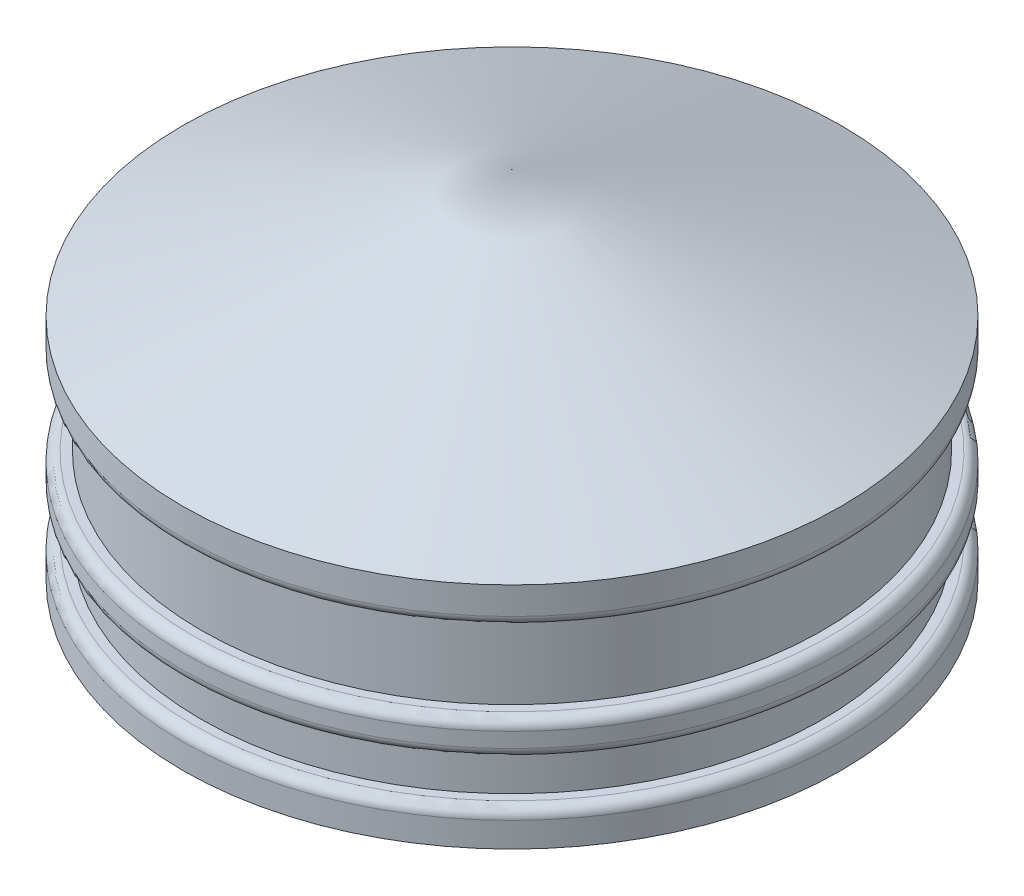
ISO-10303-21;
HEADER;
FILE_DESCRIPTION(('STEP AP214'),'2;1');
FILE_NAME('part.step','',(''),(''),'','','');
FILE_SCHEMA(('AUTOMOTIVE_DESIGN { 1 0 10303 214 1 1 1 1 }'));
ENDSEC;
DATA;
#1=APPLICATION_CONTEXT('core data for automotive mechanical design processes');
#2=APPLICATION_PROTOCOL_DEFINITION('international standard','automotive_design',2000,#1);
#3=PRODUCT_CONTEXT('',#1,'mechanical');
#4=PRODUCT('Part','Part','',(#3));
#5=PRODUCT_RELATED_PRODUCT_CATEGORY('part','',(#4));
#6=PRODUCT_DEFINITION_FORMATION('','',#4);
#7=PRODUCT_DEFINITION_CONTEXT('part definition',#1,'design');
#8=PRODUCT_DEFINITION('design','',#6,#7);
#9=PRODUCT_DEFINITION_SHAPE('','',#8);
#10=(LENGTH_UNIT() NAMED_UNIT(*) SI_UNIT(.MILLI.,.METRE.));
#11=(NAMED_UNIT(*) PLANE_ANGLE_UNIT() SI_UNIT($,.RADIAN.));
#12=(NAMED_UNIT(*) SI_UNIT($,.STERADIAN.) SOLID_ANGLE_UNIT());
#13=UNCERTAINTY_MEASURE_WITH_UNIT(LENGTH_MEASURE(1.E-05),#10,'distance_accuracy_value','');
#14=(GEOMETRIC_REPRESENTATION_CONTEXT(3) GLOBAL_UNCERTAINTY_ASSIGNED_CONTEXT((#13)) GLOBAL_UNIT_ASSIGNED_CONTEXT((#10,
#11,#12)) REPRESENTATION_CONTEXT('',''));
#15=CARTESIAN_POINT('',(0.,0.,0.));
#16=DIRECTION('',(0.,0.,1.));
#17=DIRECTION('',(1.,0.,0.));
#18=AXIS2_PLACEMENT_3D('',#15,#16,#17);
#19=CARTESIAN_POINT('',(0.,-0.714999999999999,0.));
#20=DIRECTION('',(0.,-1.,0.));
#21=DIRECTION('',(0.,0.,-1.));
#22=AXIS2_PLACEMENT_3D('',#19,#20,#21);
#23=CYLINDRICAL_SURFACE('',#22,13.25);
#24=CARTESIAN_POINT('',(0.,4.1,0.));
#25=DIRECTION('',(0.,1.,0.));
#26=DIRECTION('',(0.,0.,1.));
#27=AXIS2_PLACEMENT_3D('',#24,#25,#26);
#28=CIRCLE('',#27,13.25);
#29=CARTESIAN_POINT('',(0.,4.1,13.25));
#30=VERTEX_POINT('',#29);
#31=EDGE_CURVE('E126',#30,#30,#28,.F.);
#32=ORIENTED_EDGE('',*,*,#31,.T.);
#33=EDGE_LOOP('',(#32));
#34=FACE_BOUND('',#33,.T.);
#35=CARTESIAN_POINT('',(0.,3.5,0.));
#36=DIRECTION('',(0.,1.,0.));
#37=DIRECTION('',(0.,0.,1.));
#38=AXIS2_PLACEMENT_3D('',#35,#36,#37);
#39=CIRCLE('',#38,13.25);
#40=CARTESIAN_POINT('',(0.,3.5,13.25));
#41=VERTEX_POINT('',#40);
#42=EDGE_CURVE('E123',#41,#41,#39,.T.);
#43=ORIENTED_EDGE('',*,*,#42,.T.);
#44=EDGE_LOOP('',(#43));
#45=FACE_BOUND('',#44,.T.);
#46=ADVANCED_FACE('F36',(#34,#45),#23,.T.);
#47=CARTESIAN_POINT('',(0.,1.,0.));
#48=DIRECTION('',(0.,1.,0.));
#49=DIRECTION('',(0.,0.,1.));
#50=AXIS2_PLACEMENT_3D('',#47,#48,#49);
#51=CIRCLE('',#50,13.25);
#52=CARTESIAN_POINT('',(0.,1.,13.25));
#53=VERTEX_POINT('',#52);
#54=EDGE_CURVE('E11',#53,#53,#51,.F.);
#55=ORIENTED_EDGE('',*,*,#54,.T.);
#56=EDGE_LOOP('',(#55));
#57=FACE_BOUND('',#56,.T.);
#58=CARTESIAN_POINT('',(0.,0.,0.));
#59=DIRECTION('',(0.,-1.,0.));
#60=DIRECTION('',(0.,0.,-1.));
#61=AXIS2_PLACEMENT_3D('',#58,#59,#60);
#62=CIRCLE('',#61,13.25);
#63=CARTESIAN_POINT('',(0.,0.,-13.25));
#64=VERTEX_POINT('',#63);
#65=EDGE_CURVE('E95',#64,#64,#62,.T.);
#66=ORIENTED_EDGE('',*,*,#65,.F.);
#67=EDGE_LOOP('',(#66));
#68=FACE_BOUND('',#67,.T.);
#69=ADVANCED_FACE('F53',(#57,#68),#23,.T.);
#70=CARTESIAN_POINT('',(0.,10.5496844798692,0.));
#71=DIRECTION('',(0.,-1.,0.));
#72=DIRECTION('',(0.,0.,-1.));
#73=AXIS2_PLACEMENT_3D('',#70,#71,#72);
#74=CONICAL_SURFACE('',#73,0.,1.20336964848143);
#75=CARTESIAN_POINT('',(0.,6.79685429118995,0.));
#76=DIRECTION('',(0.,-1.,0.));
#77=DIRECTION('',(0.,0.,-1.));
#78=AXIS2_PLACEMENT_3D('',#75,#76,#77);
#79=CIRCLE('',#78,9.75);
#80=CARTESIAN_POINT('',(0.,6.79685429118995,-9.75));
#81=VERTEX_POINT('',#80);
#82=EDGE_CURVE('E114',#81,#81,#79,.T.);
#83=ORIENTED_EDGE('',*,*,#82,.T.);
#84=EDGE_LOOP('',(#83));
#85=FACE_BOUND('',#84,.T.);
#86=CARTESIAN_POINT('',(0.,10.5496844798692,0.));
#87=VERTEX_POINT('',#86);
#88=VERTEX_LOOP('',#87);
#89=FACE_BOUND('',#88,.T.);
#90=ADVANCED_FACE('F50',(#85,#89),#74,.F.);
#91=CARTESIAN_POINT('',(0.,-0.714999999999999,0.));
#92=DIRECTION('',(0.,-1.,0.));
#93=DIRECTION('',(0.,0.,-1.));
#94=AXIS2_PLACEMENT_3D('',#91,#92,#93);
#95=CYLINDRICAL_SURFACE('',#94,9.75);
#96=CARTESIAN_POINT('',(0.,3.5,0.));
#97=DIRECTION('',(0.,-1.,0.));
#98=DIRECTION('',(0.,0.,-1.));
#99=AXIS2_PLACEMENT_3D('',#96,#97,#98);
#100=CIRCLE('',#99,9.75);
#101=CARTESIAN_POINT('',(0.,3.5,-9.75));
#102=VERTEX_POINT('',#101);
#103=EDGE_CURVE('E111',#102,#102,#100,.T.);
#104=ORIENTED_EDGE('',*,*,#103,.T.);
#105=EDGE_LOOP('',(#104));
#106=FACE_BOUND('',#105,.T.);
#107=ORIENTED_EDGE('',*,*,#82,.F.);
#108=EDGE_LOOP('',(#107));
#109=FACE_BOUND('',#108,.T.);
#110=ADVANCED_FACE('F52',(#106,#109),#95,.F.);
#111=CARTESIAN_POINT('',(0.,3.5,-8.15));
#112=DIRECTION('',(0.,1.,0.));
#113=DIRECTION('',(0.,0.,1.));
#114=AXIS2_PLACEMENT_3D('',#111,#112,#113);
#115=PLANE('',#114);
#116=CARTESIAN_POINT('',(0.,3.5,0.));
#117=DIRECTION('',(0.,-1.,0.));
#118=DIRECTION('',(0.,0.,-1.));
#119=AXIS2_PLACEMENT_3D('',#116,#117,#118);
#120=CIRCLE('',#119,8.15);
#121=CARTESIAN_POINT('',(0.,3.5,-8.15));
#122=VERTEX_POINT('',#121);
#123=EDGE_CURVE('E108',#122,#122,#120,.T.);
#124=ORIENTED_EDGE('',*,*,#123,.T.);
#125=EDGE_LOOP('',(#124));
#126=FACE_BOUND('',#125,.T.);
#127=ORIENTED_EDGE('',*,*,#103,.F.);
#128=EDGE_LOOP('',(#127));
#129=FACE_BOUND('',#128,.T.);
#130=ADVANCED_FACE('F60',(#126,#129),#115,.T.);
#131=CARTESIAN_POINT('',(0.,-0.714999999999999,0.));
#132=DIRECTION('',(0.,-1.,0.));
#133=DIRECTION('',(0.,0.,-1.));
#134=AXIS2_PLACEMENT_3D('',#131,#132,#133);
#135=CYLINDRICAL_SURFACE('',#134,8.15);
#136=CARTESIAN_POINT('',(0.,0.,0.));
#137=DIRECTION('',(0.,-1.,0.));
#138=DIRECTION('',(0.,0.,-1.));
#139=AXIS2_PLACEMENT_3D('',#136,#137,#138);
#140=CIRCLE('',#139,8.15);
#141=CARTESIAN_POINT('',(0.,0.,-8.15));
#142=VERTEX_POINT('',#141);
#143=EDGE_CURVE('E99',#142,#142,#140,.T.);
#144=ORIENTED_EDGE('',*,*,#143,.T.);
#145=EDGE_LOOP('',(#144));
#146=FACE_BOUND('',#145,.T.);
#147=ORIENTED_EDGE('',*,*,#123,.F.);
#148=EDGE_LOOP('',(#147));
#149=FACE_BOUND('',#148,.T.);
#150=ADVANCED_FACE('F151',(#146,#149),#135,.F.);
#151=CARTESIAN_POINT('',(0.,0.,-13.25));
#152=DIRECTION('',(0.,-1.,0.));
#153=DIRECTION('',(0.,0.,-1.));
#154=AXIS2_PLACEMENT_3D('',#151,#152,#153);
#155=PLANE('',#154);
#156=ORIENTED_EDGE('',*,*,#65,.T.);
#157=EDGE_LOOP('',(#156));
#158=FACE_BOUND('',#157,.T.);
#159=ORIENTED_EDGE('',*,*,#143,.F.);
#160=EDGE_LOOP('',(#159));
#161=FACE_BOUND('',#160,.T.);
#162=ADVANCED_FACE('F147',(#158,#161),#155,.T.);
#163=CARTESIAN_POINT('',(0.,3.1,0.));
#164=DIRECTION('',(0.,1.,0.));
#165=DIRECTION('',(0.,0.,1.));
#166=AXIS2_PLACEMENT_3D('',#163,#164,#165);
#167=PLANE('',#166);
#168=CARTESIAN_POINT('',(0.,3.1,0.));
#169=DIRECTION('',(0.,1.,0.));
#170=DIRECTION('',(0.,0.,1.));
#171=AXIS2_PLACEMENT_3D('',#168,#169,#170);
#172=CIRCLE('',#171,12.85);
#173=CARTESIAN_POINT('',(0.,3.1,12.85));
#174=VERTEX_POINT('',#173);
#175=EDGE_CURVE('E128',#174,#174,#172,.F.);
#176=ORIENTED_EDGE('',*,*,#175,.T.);
#177=EDGE_LOOP('',(#176));
#178=FACE_BOUND('',#177,.T.);
#179=CARTESIAN_POINT('',(0.,3.1,0.));
#180=DIRECTION('',(0.,1.,0.));
#181=DIRECTION('',(0.,0.,1.));
#182=AXIS2_PLACEMENT_3D('',#179,#180,#181);
#183=CIRCLE('',#182,12.5);
#184=CARTESIAN_POINT('',(0.,3.1,12.5));
#185=VERTEX_POINT('',#184);
#186=EDGE_CURVE('E96',#185,#185,#183,.T.);
#187=ORIENTED_EDGE('',*,*,#186,.T.);
#188=EDGE_LOOP('',(#187));
#189=FACE_BOUND('',#188,.T.);
#190=ADVANCED_FACE('F150',(#178,#189),#167,.F.);
#191=CARTESIAN_POINT('',(0.,1.4,0.));
#192=DIRECTION('',(0.,1.,0.));
#193=DIRECTION('',(0.,0.,1.));
#194=AXIS2_PLACEMENT_3D('',#191,#192,#193);
#195=PLANE('',#194);
#196=CARTESIAN_POINT('',(0.,1.4,0.));
#197=DIRECTION('',(0.,1.,0.));
#198=DIRECTION('',(0.,0.,1.));
#199=AXIS2_PLACEMENT_3D('',#196,#197,#198);
#200=CIRCLE('',#199,12.85);
#201=CARTESIAN_POINT('',(0.,1.4,12.85));
#202=VERTEX_POINT('',#201);
#203=EDGE_CURVE('E44',#202,#202,#200,.T.);
#204=ORIENTED_EDGE('',*,*,#203,.T.);
#205=EDGE_LOOP('',(#204));
#206=FACE_BOUND('',#205,.T.);
#207=CARTESIAN_POINT('',(0.,1.4,0.));
#208=DIRECTION('',(0.,1.,0.));
#209=DIRECTION('',(0.,0.,1.));
#210=AXIS2_PLACEMENT_3D('',#207,#208,#209);
#211=CIRCLE('',#210,12.5);
#212=CARTESIAN_POINT('',(0.,1.4,12.5));
#213=VERTEX_POINT('',#212);
#214=EDGE_CURVE('E102',#213,#213,#211,.T.);
#215=ORIENTED_EDGE('',*,*,#214,.F.);
#216=EDGE_LOOP('',(#215));
#217=FACE_BOUND('',#216,.T.);
#218=ADVANCED_FACE('F133',(#206,#217),#195,.T.);
#219=CARTESIAN_POINT('',(0.,3.1,0.));
#220=DIRECTION('',(0.,-1.,0.));
#221=DIRECTION('',(0.,0.,-1.));
#222=AXIS2_PLACEMENT_3D('',#219,#220,#221);
#223=CYLINDRICAL_SURFACE('',#222,12.5);
#224=ORIENTED_EDGE('',*,*,#186,.F.);
#225=EDGE_LOOP('',(#224));
#226=FACE_BOUND('',#225,.T.);
#227=ORIENTED_EDGE('',*,*,#214,.T.);
#228=EDGE_LOOP('',(#227));
#229=FACE_BOUND('',#228,.T.);
#230=ADVANCED_FACE('F192',(#226,#229),#223,.T.);
#231=CARTESIAN_POINT('',(0.,7.7,0.));
#232=DIRECTION('',(0.,1.,0.));
#233=DIRECTION('',(0.,0.,1.));
#234=AXIS2_PLACEMENT_3D('',#231,#232,#233);
#235=PLANE('',#234);
#236=CARTESIAN_POINT('',(0.,7.7,0.));
#237=DIRECTION('',(0.,1.,0.));
#238=DIRECTION('',(0.,0.,1.));
#239=AXIS2_PLACEMENT_3D('',#236,#237,#238);
#240=CIRCLE('',#239,12.85);
#241=CARTESIAN_POINT('',(0.,7.7,12.85));
#242=VERTEX_POINT('',#241);
#243=EDGE_CURVE('E117',#242,#242,#240,.F.);
#244=ORIENTED_EDGE('',*,*,#243,.T.);
#245=EDGE_LOOP('',(#244));
#246=FACE_BOUND('',#245,.T.);
#247=CARTESIAN_POINT('',(0.,7.7,0.));
#248=DIRECTION('',(0.,1.,0.));
#249=DIRECTION('',(0.,0.,1.));
#250=AXIS2_PLACEMENT_3D('',#247,#248,#249);
#251=CIRCLE('',#250,12.5);
#252=CARTESIAN_POINT('',(0.,7.7,12.5));
#253=VERTEX_POINT('',#252);
#254=EDGE_CURVE('E286',#253,#253,#251,.T.);
#255=ORIENTED_EDGE('',*,*,#254,.T.);
#256=EDGE_LOOP('',(#255));
#257=FACE_BOUND('',#256,.T.);
#258=ADVANCED_FACE('F200',(#246,#257),#235,.F.);
#259=CARTESIAN_POINT('',(0.,4.5,0.));
#260=DIRECTION('',(0.,1.,0.));
#261=DIRECTION('',(0.,0.,1.));
#262=AXIS2_PLACEMENT_3D('',#259,#260,#261);
#263=PLANE('',#262);
#264=CARTESIAN_POINT('',(0.,4.5,0.));
#265=DIRECTION('',(0.,1.,0.));
#266=DIRECTION('',(0.,0.,1.));
#267=AXIS2_PLACEMENT_3D('',#264,#265,#266);
#268=CIRCLE('',#267,12.85);
#269=CARTESIAN_POINT('',(0.,4.5,12.85));
#270=VERTEX_POINT('',#269);
#271=EDGE_CURVE('E120',#270,#270,#268,.T.);
#272=ORIENTED_EDGE('',*,*,#271,.T.);
#273=EDGE_LOOP('',(#272));
#274=FACE_BOUND('',#273,.T.);
#275=CARTESIAN_POINT('',(0.,4.5,0.));
#276=DIRECTION('',(0.,1.,0.));
#277=DIRECTION('',(0.,0.,1.));
#278=AXIS2_PLACEMENT_3D('',#275,#276,#277);
#279=CIRCLE('',#278,12.5);
#280=CARTESIAN_POINT('',(0.,4.5,12.5));
#281=VERTEX_POINT('',#280);
#282=EDGE_CURVE('E284',#281,#281,#279,.T.);
#283=ORIENTED_EDGE('',*,*,#282,.F.);
#284=EDGE_LOOP('',(#283));
#285=FACE_BOUND('',#284,.T.);
#286=ADVANCED_FACE('F208',(#274,#285),#263,.T.);
#287=CARTESIAN_POINT('',(0.,7.7,0.));
#288=DIRECTION('',(0.,-1.,0.));
#289=DIRECTION('',(0.,0.,-1.));
#290=AXIS2_PLACEMENT_3D('',#287,#288,#289);
#291=CYLINDRICAL_SURFACE('',#290,12.5);
#292=ORIENTED_EDGE('',*,*,#254,.F.);
#293=EDGE_LOOP('',(#292));
#294=FACE_BOUND('',#293,.T.);
#295=ORIENTED_EDGE('',*,*,#282,.T.);
#296=EDGE_LOOP('',(#295));
#297=FACE_BOUND('',#296,.T.);
#298=ADVANCED_FACE('F86',(#294,#297),#291,.T.);
#299=CARTESIAN_POINT('',(0.,9.2,0.));
#300=DIRECTION('',(0.,-1.,0.));
#301=DIRECTION('',(0.,0.,-1.));
#302=AXIS2_PLACEMENT_3D('',#299,#300,#301);
#303=CONICAL_SURFACE('',#302,13.25,1.20336964848143);
#304=CARTESIAN_POINT('',(0.,14.3,0.));
#305=VERTEX_POINT('',#304);
#306=VERTEX_LOOP('',#305);
#307=FACE_BOUND('',#306,.T.);
#308=CARTESIAN_POINT('',(0.,9.2,0.));
#309=DIRECTION('',(0.,-1.,0.));
#310=DIRECTION('',(0.,0.,-1.));
#311=AXIS2_PLACEMENT_3D('',#308,#309,#310);
#312=CIRCLE('',#311,13.25);
#313=CARTESIAN_POINT('',(0.,9.2,-13.25));
#314=VERTEX_POINT('',#313);
#315=EDGE_CURVE('E93',#314,#314,#312,.T.);
#316=ORIENTED_EDGE('',*,*,#315,.F.);
#317=EDGE_LOOP('',(#316));
#318=FACE_BOUND('',#317,.T.);
#319=ADVANCED_FACE('F78',(#307,#318),#303,.T.);
#320=CARTESIAN_POINT('',(0.,8.1,0.));
#321=DIRECTION('',(0.,1.,0.));
#322=DIRECTION('',(0.,0.,1.));
#323=AXIS2_PLACEMENT_3D('',#320,#321,#322);
#324=CIRCLE('',#323,13.25);
#325=CARTESIAN_POINT('',(0.,8.1,13.25));
#326=VERTEX_POINT('',#325);
#327=EDGE_CURVE('E90',#326,#326,#324,.T.);
#328=ORIENTED_EDGE('',*,*,#327,.T.);
#329=EDGE_LOOP('',(#328));
#330=FACE_BOUND('',#329,.T.);
#331=ORIENTED_EDGE('',*,*,#315,.T.);
#332=EDGE_LOOP('',(#331));
#333=FACE_BOUND('',#332,.T.);
#334=ADVANCED_FACE('F65',(#330,#333),#23,.T.);
#335=CARTESIAN_POINT('',(0.,8.1,0.));
#336=DIRECTION('',(0.,1.,0.));
#337=DIRECTION('',(0.,0.,1.));
#338=AXIS2_PLACEMENT_3D('',#335,#336,#337);
#339=TOROIDAL_SURFACE('',#338,12.85,0.4);
#340=ORIENTED_EDGE('',*,*,#243,.F.);
#341=EDGE_LOOP('',(#340));
#342=FACE_BOUND('',#341,.T.);
#343=ORIENTED_EDGE('',*,*,#327,.F.);
#344=EDGE_LOOP('',(#343));
#345=FACE_BOUND('',#344,.T.);
#346=ADVANCED_FACE('F77',(#342,#345),#339,.T.);
#347=CARTESIAN_POINT('',(0.,4.1,0.));
#348=DIRECTION('',(0.,1.,0.));
#349=DIRECTION('',(0.,0.,1.));
#350=AXIS2_PLACEMENT_3D('',#347,#348,#349);
#351=TOROIDAL_SURFACE('',#350,12.85,0.4);
#352=ORIENTED_EDGE('',*,*,#31,.F.);
#353=EDGE_LOOP('',(#352));
#354=FACE_BOUND('',#353,.T.);
#355=ORIENTED_EDGE('',*,*,#271,.F.);
#356=EDGE_LOOP('',(#355));
#357=FACE_BOUND('',#356,.T.);
#358=ADVANCED_FACE('F84',(#354,#357),#351,.T.);
#359=CARTESIAN_POINT('',(0.,3.5,0.));
#360=DIRECTION('',(0.,1.,0.));
#361=DIRECTION('',(0.,0.,1.));
#362=AXIS2_PLACEMENT_3D('',#359,#360,#361);
#363=TOROIDAL_SURFACE('',#362,12.85,0.4);
#364=ORIENTED_EDGE('',*,*,#175,.F.);
#365=EDGE_LOOP('',(#364));
#366=FACE_BOUND('',#365,.T.);
#367=ORIENTED_EDGE('',*,*,#42,.F.);
#368=EDGE_LOOP('',(#367));
#369=FACE_BOUND('',#368,.T.);
#370=ADVANCED_FACE('F137',(#366,#369),#363,.T.);
#371=CARTESIAN_POINT('',(0.,1.,0.));
#372=DIRECTION('',(0.,1.,0.));
#373=DIRECTION('',(0.,0.,1.));
#374=AXIS2_PLACEMENT_3D('',#371,#372,#373);
#375=TOROIDAL_SURFACE('',#374,12.85,0.4);
#376=ORIENTED_EDGE('',*,*,#54,.F.);
#377=EDGE_LOOP('',(#376));
#378=FACE_BOUND('',#377,.T.);
#379=ORIENTED_EDGE('',*,*,#203,.F.);
#380=EDGE_LOOP('',(#379));
#381=FACE_BOUND('',#380,.T.);
#382=ADVANCED_FACE('F38',(#378,#381),#375,.T.);
#383=CLOSED_SHELL('',(#46,#69,#90,#110,#130,#150,#162,#190,#218,#230,#258,#286,#298,#319,#334,
#346,#358,#370,#382));
#384=MANIFOLD_SOLID_BREP('B2',#383);
#385=ADVANCED_BREP_SHAPE_REPRESENTATION('',(#18,#384),#14);
#386=SHAPE_DEFINITION_REPRESENTATION(#9,#385);
ENDSEC;
END-ISO-10303-21;
